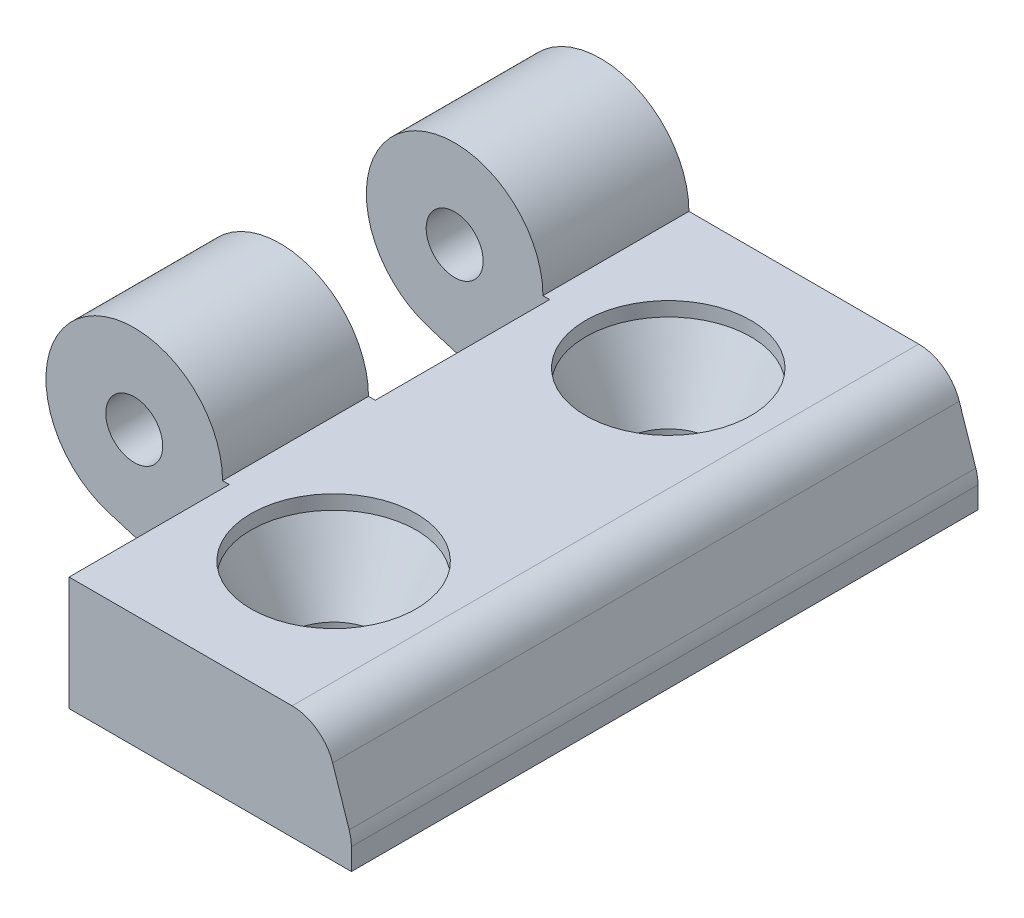
ISO-10303-21;
HEADER;
FILE_DESCRIPTION(('STEP AP214'),'2;1');
FILE_NAME('part.step','',(''),(''),'','','');
FILE_SCHEMA(('AUTOMOTIVE_DESIGN { 1 0 10303 214 1 1 1 1 }'));
ENDSEC;
DATA;
#1=APPLICATION_CONTEXT('core data for automotive mechanical design processes');
#2=APPLICATION_PROTOCOL_DEFINITION('international standard','automotive_design',2000,#1);
#3=PRODUCT_CONTEXT('',#1,'mechanical');
#4=PRODUCT('Part','Part','',(#3));
#5=PRODUCT_RELATED_PRODUCT_CATEGORY('part','',(#4));
#6=PRODUCT_DEFINITION_FORMATION('','',#4);
#7=PRODUCT_DEFINITION_CONTEXT('part definition',#1,'design');
#8=PRODUCT_DEFINITION('design','',#6,#7);
#9=PRODUCT_DEFINITION_SHAPE('','',#8);
#10=(LENGTH_UNIT() NAMED_UNIT(*) SI_UNIT(.MILLI.,.METRE.));
#11=(NAMED_UNIT(*) PLANE_ANGLE_UNIT() SI_UNIT($,.RADIAN.));
#12=(NAMED_UNIT(*) SI_UNIT($,.STERADIAN.) SOLID_ANGLE_UNIT());
#13=UNCERTAINTY_MEASURE_WITH_UNIT(LENGTH_MEASURE(1.E-05),#10,'distance_accuracy_value','');
#14=(GEOMETRIC_REPRESENTATION_CONTEXT(3) GLOBAL_UNCERTAINTY_ASSIGNED_CONTEXT((#13)) GLOBAL_UNIT_ASSIGNED_CONTEXT((#10,
#11,#12)) REPRESENTATION_CONTEXT('',''));
#15=CARTESIAN_POINT('',(0.,0.,0.));
#16=DIRECTION('',(0.,0.,1.));
#17=DIRECTION('',(1.,0.,0.));
#18=AXIS2_PLACEMENT_3D('',#15,#16,#17);
#19=CARTESIAN_POINT('',(5.00000000000045,-8.,22.));
#20=DIRECTION('',(0.,1.,0.));
#21=DIRECTION('',(0.,0.,1.));
#22=AXIS2_PLACEMENT_3D('',#19,#20,#21);
#23=PLANE('',#22);
#24=CARTESIAN_POINT('',(15.,-8.,-11.75));
#25=DIRECTION('',(0.,1.,0.));
#26=DIRECTION('',(-1.,0.,0.));
#27=AXIS2_PLACEMENT_3D('',#24,#25,#26);
#28=CIRCLE('',#27,3.25);
#29=CARTESIAN_POINT('',(11.75,-8.,-11.75));
#30=VERTEX_POINT('',#29);
#31=EDGE_CURVE('E331',#30,#30,#28,.T.);
#32=ORIENTED_EDGE('',*,*,#31,.T.);
#33=EDGE_LOOP('',(#32));
#34=FACE_BOUND('',#33,.T.);
#35=DIRECTION('',(0.,0.,-1.));
#36=VECTOR('',#35,1.);
#37=CARTESIAN_POINT('',(5.00000000000045,-8.,22.));
#38=LINE('',#37,#36);
#39=CARTESIAN_POINT('',(5.00000000000146,-8.00000000000031,10.75));
#40=VERTEX_POINT('',#39);
#41=CARTESIAN_POINT('',(5.00000000000146,-8.00000000000031,0.5));
#42=VERTEX_POINT('',#41);
#43=EDGE_CURVE('E231',#40,#42,#38,.T.);
#44=ORIENTED_EDGE('',*,*,#43,.T.);
#45=DIRECTION('',(1.,0.,0.));
#46=VECTOR('',#45,1.);
#47=CARTESIAN_POINT('',(6.67443888756299,-8.00000000000028,0.5));
#48=LINE('',#47,#46);
#49=CARTESIAN_POINT('',(6.67443888756299,-8.00000000000028,0.5));
#50=VERTEX_POINT('',#49);
#51=EDGE_CURVE('E151',#42,#50,#48,.T.);
#52=ORIENTED_EDGE('',*,*,#51,.T.);
#53=DIRECTION('',(0.,0.,-1.));
#54=VECTOR('',#53,1.);
#55=CARTESIAN_POINT('',(6.67443888756299,-8.00000000000028,0.5));
#56=LINE('',#55,#54);
#57=CARTESIAN_POINT('',(6.67443888756299,-8.00000000000028,-11.75));
#58=VERTEX_POINT('',#57);
#59=EDGE_CURVE('E147',#50,#58,#56,.T.);
#60=ORIENTED_EDGE('',*,*,#59,.T.);
#61=DIRECTION('',(-1.,0.,0.));
#62=VECTOR('',#61,1.);
#63=CARTESIAN_POINT('',(6.67443888756299,-8.00000000000028,-11.75));
#64=LINE('',#63,#62);
#65=CARTESIAN_POINT('',(5.00000000000146,-8.00000000000031,-11.75));
#66=VERTEX_POINT('',#65);
#67=EDGE_CURVE('E154',#58,#66,#64,.T.);
#68=ORIENTED_EDGE('',*,*,#67,.T.);
#69=CARTESIAN_POINT('',(5.00000000000045,-8.,-22.));
#70=VERTEX_POINT('',#69);
#71=EDGE_CURVE('E212',#66,#70,#38,.T.);
#72=ORIENTED_EDGE('',*,*,#71,.T.);
#73=DIRECTION('',(1.,0.,0.));
#74=VECTOR('',#73,1.);
#75=CARTESIAN_POINT('',(5.00000000000045,-8.,-22.));
#76=LINE('',#75,#74);
#77=CARTESIAN_POINT('',(26.5,-8.,-22.));
#78=VERTEX_POINT('',#77);
#79=EDGE_CURVE('E197',#70,#78,#76,.T.);
#80=ORIENTED_EDGE('',*,*,#79,.T.);
#81=DIRECTION('',(0.,0.,-1.));
#82=VECTOR('',#81,1.);
#83=CARTESIAN_POINT('',(26.5,-8.,22.));
#84=LINE('',#83,#82);
#85=CARTESIAN_POINT('',(26.5,-8.,22.));
#86=VERTEX_POINT('',#85);
#87=EDGE_CURVE('E253',#86,#78,#84,.T.);
#88=ORIENTED_EDGE('',*,*,#87,.F.);
#89=DIRECTION('',(1.,0.,0.));
#90=VECTOR('',#89,1.);
#91=CARTESIAN_POINT('',(5.00000000000045,-8.,22.));
#92=LINE('',#91,#90);
#93=CARTESIAN_POINT('',(6.67443888756299,-8.,22.));
#94=VERTEX_POINT('',#93);
#95=EDGE_CURVE('E198',#94,#86,#92,.T.);
#96=ORIENTED_EDGE('',*,*,#95,.F.);
#97=DIRECTION('',(0.,0.,-1.));
#98=VECTOR('',#97,1.);
#99=CARTESIAN_POINT('',(6.67443888756299,-8.00000000000028,22.));
#100=LINE('',#99,#98);
#101=CARTESIAN_POINT('',(6.67443888756299,-8.00000000000028,10.75));
#102=VERTEX_POINT('',#101);
#103=EDGE_CURVE('E58',#94,#102,#100,.T.);
#104=ORIENTED_EDGE('',*,*,#103,.T.);
#105=DIRECTION('',(-1.,0.,0.));
#106=VECTOR('',#105,1.);
#107=CARTESIAN_POINT('',(6.67443888756299,-8.00000000000028,10.75));
#108=LINE('',#107,#106);
#109=EDGE_CURVE('E180',#102,#40,#108,.T.);
#110=ORIENTED_EDGE('',*,*,#109,.T.);
#111=EDGE_LOOP('',(#44,#52,#60,#68,#72,#80,#88,#96,#104,#110));
#112=FACE_BOUND('',#111,.T.);
#113=CARTESIAN_POINT('',(15.,-8.,11.75));
#114=DIRECTION('',(0.,1.,0.));
#115=DIRECTION('',(-1.,0.,0.));
#116=AXIS2_PLACEMENT_3D('',#113,#114,#115);
#117=CIRCLE('',#116,3.25);
#118=CARTESIAN_POINT('',(11.75,-8.,11.75));
#119=VERTEX_POINT('',#118);
#120=EDGE_CURVE('E538',#119,#119,#117,.T.);
#121=ORIENTED_EDGE('',*,*,#120,.T.);
#122=EDGE_LOOP('',(#121));
#123=FACE_BOUND('',#122,.T.);
#124=ADVANCED_FACE('F35',(#34,#112,#123),#23,.F.);
#125=CARTESIAN_POINT('',(6.19999999999982,0.,22.));
#126=DIRECTION('',(0.,-1.,0.));
#127=DIRECTION('',(1.,0.,0.));
#128=AXIS2_PLACEMENT_3D('',#125,#126,#127);
#129=PLANE('',#128);
#130=CARTESIAN_POINT('',(15.,2.23866064574807E-13,-11.75));
#131=DIRECTION('',(0.,1.,0.));
#132=DIRECTION('',(-1.,0.,0.));
#133=AXIS2_PLACEMENT_3D('',#130,#131,#132);
#134=CIRCLE('',#133,5.8);
#135=CARTESIAN_POINT('',(9.2,2.26381413614973E-13,-11.75));
#136=VERTEX_POINT('',#135);
#137=EDGE_CURVE('E346',#136,#136,#134,.T.);
#138=ORIENTED_EDGE('',*,*,#137,.F.);
#139=EDGE_LOOP('',(#138));
#140=FACE_BOUND('',#139,.T.);
#141=DIRECTION('',(0.,0.,1.));
#142=VECTOR('',#141,1.);
#143=CARTESIAN_POINT('',(6.67443888756287,0.,22.));
#144=LINE('',#143,#142);
#145=CARTESIAN_POINT('',(6.67443888756287,0.,-11.75));
#146=VERTEX_POINT('',#145);
#147=CARTESIAN_POINT('',(6.67443888756287,0.,0.5));
#148=VERTEX_POINT('',#147);
#149=EDGE_CURVE('E11',#146,#148,#144,.T.);
#150=ORIENTED_EDGE('',*,*,#149,.T.);
#151=DIRECTION('',(-1.,0.,0.));
#152=VECTOR('',#151,1.);
#153=CARTESIAN_POINT('',(6.19999999999982,0.,0.5));
#154=LINE('',#153,#152);
#155=CARTESIAN_POINT('',(6.19999999999991,0.,0.5));
#156=VERTEX_POINT('',#155);
#157=EDGE_CURVE('E176',#148,#156,#154,.T.);
#158=ORIENTED_EDGE('',*,*,#157,.T.);
#159=DIRECTION('',(0.,0.,-1.));
#160=VECTOR('',#159,1.);
#161=CARTESIAN_POINT('',(6.19999999999982,0.,22.));
#162=LINE('',#161,#160);
#163=CARTESIAN_POINT('',(6.19999999999991,0.,10.75));
#164=VERTEX_POINT('',#163);
#165=EDGE_CURVE('E238',#164,#156,#162,.T.);
#166=ORIENTED_EDGE('',*,*,#165,.F.);
#167=DIRECTION('',(1.,0.,0.));
#168=VECTOR('',#167,1.);
#169=CARTESIAN_POINT('',(6.19999999999982,0.,10.75));
#170=LINE('',#169,#168);
#171=CARTESIAN_POINT('',(6.67443888756288,0.,10.75));
#172=VERTEX_POINT('',#171);
#173=EDGE_CURVE('E194',#164,#172,#170,.T.);
#174=ORIENTED_EDGE('',*,*,#173,.T.);
#175=DIRECTION('',(0.,0.,1.));
#176=VECTOR('',#175,1.);
#177=CARTESIAN_POINT('',(6.67443888756288,0.,22.));
#178=LINE('',#177,#176);
#179=CARTESIAN_POINT('',(6.67443888756288,1.14491749414469E-13,22.));
#180=VERTEX_POINT('',#179);
#181=EDGE_CURVE('E186',#172,#180,#178,.T.);
#182=ORIENTED_EDGE('',*,*,#181,.T.);
#183=DIRECTION('',(-1.,0.,0.));
#184=VECTOR('',#183,1.);
#185=CARTESIAN_POINT('',(6.19999999999982,0.,22.));
#186=LINE('',#185,#184);
#187=CARTESIAN_POINT('',(22.3377223398315,2.26381413614973E-13,22.));
#188=VERTEX_POINT('',#187);
#189=EDGE_CURVE('E209',#188,#180,#186,.T.);
#190=ORIENTED_EDGE('',*,*,#189,.F.);
#191=DIRECTION('',(0.,0.,-1.));
#192=VECTOR('',#191,1.);
#193=CARTESIAN_POINT('',(22.3377223398315,2.26381413614973E-13,22.));
#194=LINE('',#193,#192);
#195=CARTESIAN_POINT('',(22.3377223398315,2.26381413614973E-13,-22.));
#196=VERTEX_POINT('',#195);
#197=EDGE_CURVE('E241',#188,#196,#194,.T.);
#198=ORIENTED_EDGE('',*,*,#197,.T.);
#199=DIRECTION('',(-1.,0.,0.));
#200=VECTOR('',#199,1.);
#201=CARTESIAN_POINT('',(6.19999999999982,0.,-22.));
#202=LINE('',#201,#200);
#203=CARTESIAN_POINT('',(6.19999999999982,0.,-22.));
#204=VERTEX_POINT('',#203);
#205=EDGE_CURVE('E223',#196,#204,#202,.T.);
#206=ORIENTED_EDGE('',*,*,#205,.T.);
#207=CARTESIAN_POINT('',(6.19999999999991,0.,-11.75));
#208=VERTEX_POINT('',#207);
#209=EDGE_CURVE('E237',#208,#204,#162,.T.);
#210=ORIENTED_EDGE('',*,*,#209,.F.);
#211=DIRECTION('',(1.,0.,0.));
#212=VECTOR('',#211,1.);
#213=CARTESIAN_POINT('',(6.19999999999982,0.,-11.75));
#214=LINE('',#213,#212);
#215=EDGE_CURVE('E172',#208,#146,#214,.T.);
#216=ORIENTED_EDGE('',*,*,#215,.T.);
#217=EDGE_LOOP('',(#150,#158,#166,#174,#182,#190,#198,#206,#210,#216));
#218=FACE_BOUND('',#217,.T.);
#219=CARTESIAN_POINT('',(15.,2.23866064574807E-13,11.75));
#220=DIRECTION('',(0.,1.,0.));
#221=DIRECTION('',(-1.,0.,0.));
#222=AXIS2_PLACEMENT_3D('',#219,#220,#221);
#223=CIRCLE('',#222,5.8);
#224=CARTESIAN_POINT('',(9.2,2.26381413614973E-13,11.75));
#225=VERTEX_POINT('',#224);
#226=EDGE_CURVE('E334',#225,#225,#223,.T.);
#227=ORIENTED_EDGE('',*,*,#226,.F.);
#228=EDGE_LOOP('',(#227));
#229=FACE_BOUND('',#228,.T.);
#230=ADVANCED_FACE('F276',(#140,#218,#229),#129,.F.);
#231=CARTESIAN_POINT('',(0.,0.,22.));
#232=DIRECTION('',(0.,0.,-1.));
#233=DIRECTION('',(-1.,0.,0.));
#234=AXIS2_PLACEMENT_3D('',#231,#232,#233);
#235=CYLINDRICAL_SURFACE('',#234,6.19999999999991);
#236=DIRECTION('',(0.,0.,-1.));
#237=VECTOR('',#236,1.);
#238=CARTESIAN_POINT('',(-1.80318600538229,-5.93199125336445,22.));
#239=LINE('',#238,#237);
#240=CARTESIAN_POINT('',(-1.80318600538229,-5.93199125336445,-11.75));
#241=VERTEX_POINT('',#240);
#242=CARTESIAN_POINT('',(-1.80318600538229,-5.93199125336445,-22.));
#243=VERTEX_POINT('',#242);
#244=EDGE_CURVE('E233',#241,#243,#239,.T.);
#245=ORIENTED_EDGE('',*,*,#244,.F.);
#246=CARTESIAN_POINT('',(0.,0.,-11.75));
#247=DIRECTION('',(0.,0.,-1.));
#248=DIRECTION('',(-1.,0.,0.));
#249=AXIS2_PLACEMENT_3D('',#246,#247,#248);
#250=CIRCLE('',#249,6.19999999999991);
#251=EDGE_CURVE('E50',#241,#208,#250,.T.);
#252=ORIENTED_EDGE('',*,*,#251,.T.);
#253=ORIENTED_EDGE('',*,*,#209,.T.);
#254=CARTESIAN_POINT('',(0.,0.,-22.));
#255=DIRECTION('',(0.,0.,1.));
#256=DIRECTION('',(1.,0.,0.));
#257=AXIS2_PLACEMENT_3D('',#254,#255,#256);
#258=CIRCLE('',#257,6.19999999999991);
#259=EDGE_CURVE('E226',#204,#243,#258,.T.);
#260=ORIENTED_EDGE('',*,*,#259,.T.);
#261=EDGE_LOOP('',(#245,#252,#253,#260));
#262=FACE_BOUND('',#261,.T.);
#263=ADVANCED_FACE('F281',(#262),#235,.T.);
#264=CARTESIAN_POINT('',(5.00000000000045,-8.,22.));
#265=DIRECTION('',(0.290836452481103,0.956772782800706,0.));
#266=DIRECTION('',(-0.956772782800706,0.290836452481103,0.));
#267=AXIS2_PLACEMENT_3D('',#264,#265,#266);
#268=PLANE('',#267);
#269=CARTESIAN_POINT('',(-1.80318600538229,-5.93199125336455,10.75));
#270=VERTEX_POINT('',#269);
#271=CARTESIAN_POINT('',(-1.80318600538229,-5.93199125336455,0.500000000000001));
#272=VERTEX_POINT('',#271);
#273=EDGE_CURVE('E234',#270,#272,#239,.T.);
#274=ORIENTED_EDGE('',*,*,#273,.T.);
#275=DIRECTION('',(0.956772782800706,-0.290836452481103,0.));
#276=VECTOR('',#275,1.);
#277=CARTESIAN_POINT('',(5.00000000000045,-8.,0.5));
#278=LINE('',#277,#276);
#279=EDGE_CURVE('E43',#272,#42,#278,.T.);
#280=ORIENTED_EDGE('',*,*,#279,.T.);
#281=ORIENTED_EDGE('',*,*,#43,.F.);
#282=DIRECTION('',(-0.956772782800706,0.290836452481103,0.));
#283=VECTOR('',#282,1.);
#284=CARTESIAN_POINT('',(5.00000000000045,-8.,10.75));
#285=LINE('',#284,#283);
#286=EDGE_CURVE('E256',#40,#270,#285,.T.);
#287=ORIENTED_EDGE('',*,*,#286,.T.);
#288=EDGE_LOOP('',(#274,#280,#281,#287));
#289=FACE_BOUND('',#288,.T.);
#290=ADVANCED_FACE('F264',(#289),#268,.F.);
#291=CARTESIAN_POINT('',(26.5,-8.,22.));
#292=DIRECTION('',(-1.,0.,0.));
#293=DIRECTION('',(0.,0.,1.));
#294=AXIS2_PLACEMENT_3D('',#291,#292,#293);
#295=PLANE('',#294);
#296=DIRECTION('',(0.,1.,0.));
#297=VECTOR('',#296,1.);
#298=CARTESIAN_POINT('',(26.5,-8.,-22.));
#299=LINE('',#298,#297);
#300=CARTESIAN_POINT('',(26.5,-6.48683298050492,-22.));
#301=VERTEX_POINT('',#300);
#302=EDGE_CURVE('E215',#78,#301,#299,.T.);
#303=ORIENTED_EDGE('',*,*,#302,.T.);
#304=DIRECTION('',(0.,0.,-1.));
#305=VECTOR('',#304,1.);
#306=CARTESIAN_POINT('',(26.5,-6.48683298050492,22.));
#307=LINE('',#306,#305);
#308=CARTESIAN_POINT('',(26.5,-6.48683298050492,22.));
#309=VERTEX_POINT('',#308);
#310=EDGE_CURVE('E250',#309,#301,#307,.T.);
#311=ORIENTED_EDGE('',*,*,#310,.F.);
#312=DIRECTION('',(0.,1.,0.));
#313=VECTOR('',#312,1.);
#314=CARTESIAN_POINT('',(26.5,-8.,22.));
#315=LINE('',#314,#313);
#316=EDGE_CURVE('E200',#86,#309,#315,.T.);
#317=ORIENTED_EDGE('',*,*,#316,.F.);
#318=ORIENTED_EDGE('',*,*,#87,.T.);
#319=EDGE_LOOP('',(#303,#311,#317,#318));
#320=FACE_BOUND('',#319,.T.);
#321=ADVANCED_FACE('F295',(#320),#295,.F.);
#322=CARTESIAN_POINT('',(23.5,-6.48683298050492,22.));
#323=DIRECTION('',(0.,0.,-1.));
#324=DIRECTION('',(-1.,0.,0.));
#325=AXIS2_PLACEMENT_3D('',#322,#323,#324);
#326=CYLINDRICAL_SURFACE('',#325,3.00000000000007);
#327=CARTESIAN_POINT('',(23.5,-6.48683298050492,-22.));
#328=DIRECTION('',(0.,0.,1.));
#329=DIRECTION('',(1.,0.,0.));
#330=AXIS2_PLACEMENT_3D('',#327,#328,#329);
#331=CIRCLE('',#330,3.00000000000007);
#332=CARTESIAN_POINT('',(26.3460498941517,-5.53814968245458,-22.));
#333=VERTEX_POINT('',#332);
#334=EDGE_CURVE('E217',#301,#333,#331,.T.);
#335=ORIENTED_EDGE('',*,*,#334,.T.);
#336=DIRECTION('',(0.,0.,-1.));
#337=VECTOR('',#336,1.);
#338=CARTESIAN_POINT('',(26.3460498941517,-5.53814968245458,22.));
#339=LINE('',#338,#337);
#340=CARTESIAN_POINT('',(26.3460498941517,-5.53814968245458,22.));
#341=VERTEX_POINT('',#340);
#342=EDGE_CURVE('E247',#341,#333,#339,.T.);
#343=ORIENTED_EDGE('',*,*,#342,.F.);
#344=CARTESIAN_POINT('',(23.5,-6.48683298050492,22.));
#345=DIRECTION('',(0.,0.,1.));
#346=DIRECTION('',(1.,0.,0.));
#347=AXIS2_PLACEMENT_3D('',#344,#345,#346);
#348=CIRCLE('',#347,3.00000000000007);
#349=EDGE_CURVE('E203',#309,#341,#348,.T.);
#350=ORIENTED_EDGE('',*,*,#349,.F.);
#351=ORIENTED_EDGE('',*,*,#310,.T.);
#352=EDGE_LOOP('',(#335,#343,#350,#351));
#353=FACE_BOUND('',#352,.T.);
#354=ADVANCED_FACE('F313',(#353),#326,.T.);
#355=CARTESIAN_POINT('',(26.3460498941518,-5.53814968245456,22.));
#356=DIRECTION('',(-0.948683298050495,-0.316227766016894,0.));
#357=DIRECTION('',(0.316227766016894,-0.948683298050495,0.));
#358=AXIS2_PLACEMENT_3D('',#355,#356,#357);
#359=PLANE('',#358);
#360=DIRECTION('',(-0.316227766016894,0.948683298050495,0.));
#361=VECTOR('',#360,1.);
#362=CARTESIAN_POINT('',(26.3460498941518,-5.53814968245456,-22.));
#363=LINE('',#362,#361);
#364=CARTESIAN_POINT('',(25.183772233983,-2.05131670194905,-22.));
#365=VERTEX_POINT('',#364);
#366=EDGE_CURVE('E219',#333,#365,#363,.T.);
#367=ORIENTED_EDGE('',*,*,#366,.T.);
#368=DIRECTION('',(0.,0.,-1.));
#369=VECTOR('',#368,1.);
#370=CARTESIAN_POINT('',(25.183772233983,-2.05131670194905,22.));
#371=LINE('',#370,#369);
#372=CARTESIAN_POINT('',(25.183772233983,-2.05131670194905,22.));
#373=VERTEX_POINT('',#372);
#374=EDGE_CURVE('E244',#373,#365,#371,.T.);
#375=ORIENTED_EDGE('',*,*,#374,.F.);
#376=DIRECTION('',(-0.316227766016894,0.948683298050495,0.));
#377=VECTOR('',#376,1.);
#378=CARTESIAN_POINT('',(26.3460498941518,-5.53814968245456,22.));
#379=LINE('',#378,#377);
#380=EDGE_CURVE('E205',#341,#373,#379,.T.);
#381=ORIENTED_EDGE('',*,*,#380,.F.);
#382=ORIENTED_EDGE('',*,*,#342,.T.);
#383=EDGE_LOOP('',(#367,#375,#381,#382));
#384=FACE_BOUND('',#383,.T.);
#385=ADVANCED_FACE('F311',(#384),#359,.F.);
#386=CARTESIAN_POINT('',(22.3377223398315,-2.99999999999977,22.));
#387=DIRECTION('',(0.,0.,-1.));
#388=DIRECTION('',(-1.,0.,0.));
#389=AXIS2_PLACEMENT_3D('',#386,#387,#388);
#390=CYLINDRICAL_SURFACE('',#389,3.);
#391=CARTESIAN_POINT('',(22.3377223398315,-2.99999999999977,-22.));
#392=DIRECTION('',(0.,0.,1.));
#393=DIRECTION('',(1.,0.,0.));
#394=AXIS2_PLACEMENT_3D('',#391,#392,#393);
#395=CIRCLE('',#394,3.);
#396=EDGE_CURVE('E221',#365,#196,#395,.T.);
#397=ORIENTED_EDGE('',*,*,#396,.T.);
#398=ORIENTED_EDGE('',*,*,#197,.F.);
#399=CARTESIAN_POINT('',(22.3377223398315,-2.99999999999977,22.));
#400=DIRECTION('',(0.,0.,1.));
#401=DIRECTION('',(1.,0.,0.));
#402=AXIS2_PLACEMENT_3D('',#399,#400,#401);
#403=CIRCLE('',#402,3.);
#404=EDGE_CURVE('E207',#373,#188,#403,.T.);
#405=ORIENTED_EDGE('',*,*,#404,.F.);
#406=ORIENTED_EDGE('',*,*,#374,.T.);
#407=EDGE_LOOP('',(#397,#398,#405,#406));
#408=FACE_BOUND('',#407,.T.);
#409=ADVANCED_FACE('F307',(#408),#390,.T.);
#410=CARTESIAN_POINT('',(0.,0.,0.5));
#411=DIRECTION('',(0.,0.,1.));
#412=DIRECTION('',(1.,0.,0.));
#413=AXIS2_PLACEMENT_3D('',#410,#411,#412);
#414=CIRCLE('',#413,6.19999999999991);
#415=EDGE_CURVE('E174',#156,#272,#414,.T.);
#416=ORIENTED_EDGE('',*,*,#415,.T.);
#417=ORIENTED_EDGE('',*,*,#273,.F.);
#418=CARTESIAN_POINT('',(0.,0.,10.75));
#419=DIRECTION('',(0.,0.,-1.));
#420=DIRECTION('',(-1.,0.,0.));
#421=AXIS2_PLACEMENT_3D('',#418,#419,#420);
#422=CIRCLE('',#421,6.19999999999991);
#423=EDGE_CURVE('E191',#270,#164,#422,.T.);
#424=ORIENTED_EDGE('',*,*,#423,.T.);
#425=ORIENTED_EDGE('',*,*,#165,.T.);
#426=EDGE_LOOP('',(#416,#417,#424,#425));
#427=FACE_BOUND('',#426,.T.);
#428=ADVANCED_FACE('F272',(#427),#235,.T.);
#429=ORIENTED_EDGE('',*,*,#71,.F.);
#430=DIRECTION('',(-0.956772782800706,0.290836452481103,0.));
#431=VECTOR('',#430,1.);
#432=CARTESIAN_POINT('',(5.00000000000045,-8.,-11.75));
#433=LINE('',#432,#431);
#434=EDGE_CURVE('E156',#66,#241,#433,.T.);
#435=ORIENTED_EDGE('',*,*,#434,.T.);
#436=ORIENTED_EDGE('',*,*,#244,.T.);
#437=DIRECTION('',(0.956772782800706,-0.290836452481103,0.));
#438=VECTOR('',#437,1.);
#439=CARTESIAN_POINT('',(5.00000000000045,-8.,-22.));
#440=LINE('',#439,#438);
#441=EDGE_CURVE('E201',#243,#70,#440,.T.);
#442=ORIENTED_EDGE('',*,*,#441,.T.);
#443=EDGE_LOOP('',(#429,#435,#436,#442));
#444=FACE_BOUND('',#443,.T.);
#445=ADVANCED_FACE('F285',(#444),#268,.F.);
#446=CARTESIAN_POINT('',(23.5,-6.48683298050492,22.));
#447=DIRECTION('',(0.,0.,1.));
#448=DIRECTION('',(1.,0.,0.));
#449=AXIS2_PLACEMENT_3D('',#446,#447,#448);
#450=PLANE('',#449);
#451=DIRECTION('',(0.,1.,0.));
#452=VECTOR('',#451,1.);
#453=CARTESIAN_POINT('',(6.67443888756299,-8.00000000000028,22.));
#454=LINE('',#453,#452);
#455=EDGE_CURVE('E184',#94,#180,#454,.T.);
#456=ORIENTED_EDGE('',*,*,#455,.F.);
#457=ORIENTED_EDGE('',*,*,#95,.T.);
#458=ORIENTED_EDGE('',*,*,#316,.T.);
#459=ORIENTED_EDGE('',*,*,#349,.T.);
#460=ORIENTED_EDGE('',*,*,#380,.T.);
#461=ORIENTED_EDGE('',*,*,#404,.T.);
#462=ORIENTED_EDGE('',*,*,#189,.T.);
#463=EDGE_LOOP('',(#456,#457,#458,#459,#460,#461,#462));
#464=FACE_BOUND('',#463,.T.);
#465=ADVANCED_FACE('F298',(#464),#450,.T.);
#466=CARTESIAN_POINT('',(23.5,-6.48683298050492,-22.));
#467=DIRECTION('',(0.,0.,1.));
#468=DIRECTION('',(1.,0.,0.));
#469=AXIS2_PLACEMENT_3D('',#466,#467,#468);
#470=PLANE('',#469);
#471=CARTESIAN_POINT('',(0.,0.,-22.));
#472=DIRECTION('',(0.,0.,-1.));
#473=DIRECTION('',(-1.,0.,0.));
#474=AXIS2_PLACEMENT_3D('',#471,#472,#473);
#475=CIRCLE('',#474,2.);
#476=CARTESIAN_POINT('',(-2.,0.,-22.));
#477=VERTEX_POINT('',#476);
#478=EDGE_CURVE('E349',#477,#477,#475,.T.);
#479=ORIENTED_EDGE('',*,*,#478,.F.);
#480=EDGE_LOOP('',(#479));
#481=FACE_BOUND('',#480,.T.);
#482=ORIENTED_EDGE('',*,*,#79,.F.);
#483=ORIENTED_EDGE('',*,*,#441,.F.);
#484=ORIENTED_EDGE('',*,*,#259,.F.);
#485=ORIENTED_EDGE('',*,*,#205,.F.);
#486=ORIENTED_EDGE('',*,*,#396,.F.);
#487=ORIENTED_EDGE('',*,*,#366,.F.);
#488=ORIENTED_EDGE('',*,*,#334,.F.);
#489=ORIENTED_EDGE('',*,*,#302,.F.);
#490=EDGE_LOOP('',(#482,#483,#484,#485,#486,#487,#488,#489));
#491=FACE_BOUND('',#490,.T.);
#492=ADVANCED_FACE('F289',(#481,#491),#470,.F.);
#493=CARTESIAN_POINT('',(6.67443888756299,-8.00000000000028,10.75));
#494=DIRECTION('',(0.,0.,-1.));
#495=DIRECTION('',(-1.,0.,0.));
#496=AXIS2_PLACEMENT_3D('',#493,#494,#495);
#497=PLANE('',#496);
#498=CARTESIAN_POINT('',(0.,0.,10.75));
#499=DIRECTION('',(0.,0.,-1.));
#500=DIRECTION('',(-1.,0.,0.));
#501=AXIS2_PLACEMENT_3D('',#498,#499,#500);
#502=CIRCLE('',#501,2.);
#503=CARTESIAN_POINT('',(-2.,0.,10.75));
#504=VERTEX_POINT('',#503);
#505=EDGE_CURVE('E162',#504,#504,#502,.T.);
#506=ORIENTED_EDGE('',*,*,#505,.T.);
#507=EDGE_LOOP('',(#506));
#508=FACE_BOUND('',#507,.T.);
#509=ORIENTED_EDGE('',*,*,#423,.F.);
#510=ORIENTED_EDGE('',*,*,#286,.F.);
#511=ORIENTED_EDGE('',*,*,#109,.F.);
#512=DIRECTION('',(0.,1.,0.));
#513=VECTOR('',#512,1.);
#514=CARTESIAN_POINT('',(6.67443888756299,-8.00000000000028,10.75));
#515=LINE('',#514,#513);
#516=EDGE_CURVE('E183',#102,#172,#515,.T.);
#517=ORIENTED_EDGE('',*,*,#516,.T.);
#518=ORIENTED_EDGE('',*,*,#173,.F.);
#519=EDGE_LOOP('',(#509,#510,#511,#517,#518));
#520=FACE_BOUND('',#519,.T.);
#521=ADVANCED_FACE('F270',(#508,#520),#497,.F.);
#522=CARTESIAN_POINT('',(6.67443888756299,-8.00000000000028,22.));
#523=DIRECTION('',(1.,0.,0.));
#524=DIRECTION('',(0.,1.,0.));
#525=AXIS2_PLACEMENT_3D('',#522,#523,#524);
#526=PLANE('',#525);
#527=ORIENTED_EDGE('',*,*,#516,.F.);
#528=ORIENTED_EDGE('',*,*,#103,.F.);
#529=ORIENTED_EDGE('',*,*,#455,.T.);
#530=ORIENTED_EDGE('',*,*,#181,.F.);
#531=EDGE_LOOP('',(#527,#528,#529,#530));
#532=FACE_BOUND('',#531,.T.);
#533=ADVANCED_FACE('F301',(#532),#526,.F.);
#534=CARTESIAN_POINT('',(6.67443888756299,-8.00000000000028,0.5));
#535=DIRECTION('',(1.,0.,0.));
#536=DIRECTION('',(0.,1.,0.));
#537=AXIS2_PLACEMENT_3D('',#534,#535,#536);
#538=PLANE('',#537);
#539=DIRECTION('',(0.,1.,0.));
#540=VECTOR('',#539,1.);
#541=CARTESIAN_POINT('',(6.67443888756299,-8.00000000000028,-11.75));
#542=LINE('',#541,#540);
#543=EDGE_CURVE('E142',#58,#146,#542,.T.);
#544=ORIENTED_EDGE('',*,*,#543,.F.);
#545=ORIENTED_EDGE('',*,*,#59,.F.);
#546=DIRECTION('',(0.,1.,0.));
#547=VECTOR('',#546,1.);
#548=CARTESIAN_POINT('',(6.67443888756299,-8.00000000000028,0.5));
#549=LINE('',#548,#547);
#550=EDGE_CURVE('E150',#50,#148,#549,.T.);
#551=ORIENTED_EDGE('',*,*,#550,.T.);
#552=ORIENTED_EDGE('',*,*,#149,.F.);
#553=EDGE_LOOP('',(#544,#545,#551,#552));
#554=FACE_BOUND('',#553,.T.);
#555=ADVANCED_FACE('F144',(#554),#538,.F.);
#556=CARTESIAN_POINT('',(6.67443888756299,-8.00000000000028,0.5));
#557=DIRECTION('',(0.,0.,1.));
#558=DIRECTION('',(1.,0.,0.));
#559=AXIS2_PLACEMENT_3D('',#556,#557,#558);
#560=PLANE('',#559);
#561=CARTESIAN_POINT('',(0.,0.,0.5));
#562=DIRECTION('',(0.,0.,1.));
#563=DIRECTION('',(1.,0.,0.));
#564=AXIS2_PLACEMENT_3D('',#561,#562,#563);
#565=CIRCLE('',#564,2.);
#566=CARTESIAN_POINT('',(2.,0.,0.5));
#567=VERTEX_POINT('',#566);
#568=EDGE_CURVE('E165',#567,#567,#565,.T.);
#569=ORIENTED_EDGE('',*,*,#568,.T.);
#570=EDGE_LOOP('',(#569));
#571=FACE_BOUND('',#570,.T.);
#572=ORIENTED_EDGE('',*,*,#550,.F.);
#573=ORIENTED_EDGE('',*,*,#51,.F.);
#574=ORIENTED_EDGE('',*,*,#279,.F.);
#575=ORIENTED_EDGE('',*,*,#415,.F.);
#576=ORIENTED_EDGE('',*,*,#157,.F.);
#577=EDGE_LOOP('',(#572,#573,#574,#575,#576));
#578=FACE_BOUND('',#577,.T.);
#579=ADVANCED_FACE('F274',(#571,#578),#560,.F.);
#580=CARTESIAN_POINT('',(6.67443888756299,-8.00000000000028,-11.75));
#581=DIRECTION('',(0.,0.,-1.));
#582=DIRECTION('',(-1.,0.,0.));
#583=AXIS2_PLACEMENT_3D('',#580,#581,#582);
#584=PLANE('',#583);
#585=CARTESIAN_POINT('',(0.,0.,-11.75));
#586=DIRECTION('',(0.,0.,-1.));
#587=DIRECTION('',(-1.,0.,0.));
#588=AXIS2_PLACEMENT_3D('',#585,#586,#587);
#589=CIRCLE('',#588,2.);
#590=CARTESIAN_POINT('',(-2.,0.,-11.75));
#591=VERTEX_POINT('',#590);
#592=EDGE_CURVE('E38',#591,#591,#589,.T.);
#593=ORIENTED_EDGE('',*,*,#592,.T.);
#594=EDGE_LOOP('',(#593));
#595=FACE_BOUND('',#594,.T.);
#596=ORIENTED_EDGE('',*,*,#251,.F.);
#597=ORIENTED_EDGE('',*,*,#434,.F.);
#598=ORIENTED_EDGE('',*,*,#67,.F.);
#599=ORIENTED_EDGE('',*,*,#543,.T.);
#600=ORIENTED_EDGE('',*,*,#215,.F.);
#601=EDGE_LOOP('',(#596,#597,#598,#599,#600));
#602=FACE_BOUND('',#601,.T.);
#603=ADVANCED_FACE('F155',(#595,#602),#584,.F.);
#604=CARTESIAN_POINT('',(0.,0.,22.));
#605=DIRECTION('',(0.,0.,-1.));
#606=DIRECTION('',(-1.,0.,0.));
#607=AXIS2_PLACEMENT_3D('',#604,#605,#606);
#608=CYLINDRICAL_SURFACE('',#607,2.);
#609=ORIENTED_EDGE('',*,*,#478,.T.);
#610=EDGE_LOOP('',(#609));
#611=FACE_BOUND('',#610,.T.);
#612=ORIENTED_EDGE('',*,*,#592,.F.);
#613=EDGE_LOOP('',(#612));
#614=FACE_BOUND('',#613,.T.);
#615=ADVANCED_FACE('F358',(#611,#614),#608,.F.);
#616=ORIENTED_EDGE('',*,*,#568,.F.);
#617=EDGE_LOOP('',(#616));
#618=FACE_BOUND('',#617,.T.);
#619=ORIENTED_EDGE('',*,*,#505,.F.);
#620=EDGE_LOOP('',(#619));
#621=FACE_BOUND('',#620,.T.);
#622=ADVANCED_FACE('F360',(#618,#621),#608,.F.);
#623=CARTESIAN_POINT('',(15.,2.26381413614973E-13,-11.75));
#624=DIRECTION('',(0.,1.,0.));
#625=DIRECTION('',(-1.,0.,0.));
#626=AXIS2_PLACEMENT_3D('',#623,#624,#625);
#627=CYLINDRICAL_SURFACE('',#626,5.8);
#628=ORIENTED_EDGE('',*,*,#137,.T.);
#629=EDGE_LOOP('',(#628));
#630=FACE_BOUND('',#629,.T.);
#631=CARTESIAN_POINT('',(15.,-0.999999999999776,-11.75));
#632=DIRECTION('',(0.,1.,0.));
#633=DIRECTION('',(-1.,0.,0.));
#634=AXIS2_PLACEMENT_3D('',#631,#632,#633);
#635=CIRCLE('',#634,5.8);
#636=CARTESIAN_POINT('',(9.2,-0.999999999999774,-11.75));
#637=VERTEX_POINT('',#636);
#638=EDGE_CURVE('E337',#637,#637,#635,.T.);
#639=ORIENTED_EDGE('',*,*,#638,.F.);
#640=EDGE_LOOP('',(#639));
#641=FACE_BOUND('',#640,.T.);
#642=ADVANCED_FACE('F367',(#630,#641),#627,.F.);
#643=CARTESIAN_POINT('',(15.,-6.,-11.75));
#644=DIRECTION('',(0.,1.,0.));
#645=DIRECTION('',(-1.,0.,0.));
#646=AXIS2_PLACEMENT_3D('',#643,#644,#645);
#647=CONICAL_SURFACE('',#646,3.25,0.47161556786231);
#648=ORIENTED_EDGE('',*,*,#638,.T.);
#649=EDGE_LOOP('',(#648));
#650=FACE_BOUND('',#649,.T.);
#651=CARTESIAN_POINT('',(15.,-6.,-11.75));
#652=DIRECTION('',(0.,1.,0.));
#653=DIRECTION('',(-1.,0.,0.));
#654=AXIS2_PLACEMENT_3D('',#651,#652,#653);
#655=CIRCLE('',#654,3.25);
#656=CARTESIAN_POINT('',(11.75,-6.,-11.75));
#657=VERTEX_POINT('',#656);
#658=EDGE_CURVE('E333',#657,#657,#655,.T.);
#659=ORIENTED_EDGE('',*,*,#658,.F.);
#660=EDGE_LOOP('',(#659));
#661=FACE_BOUND('',#660,.T.);
#662=ADVANCED_FACE('F472',(#650,#661),#647,.F.);
#663=CARTESIAN_POINT('',(15.,2.26381413614973E-13,-11.75));
#664=DIRECTION('',(0.,1.,0.));
#665=DIRECTION('',(-1.,0.,0.));
#666=AXIS2_PLACEMENT_3D('',#663,#664,#665);
#667=CYLINDRICAL_SURFACE('',#666,3.25);
#668=ORIENTED_EDGE('',*,*,#658,.T.);
#669=EDGE_LOOP('',(#668));
#670=FACE_BOUND('',#669,.T.);
#671=ORIENTED_EDGE('',*,*,#31,.F.);
#672=EDGE_LOOP('',(#671));
#673=FACE_BOUND('',#672,.T.);
#674=ADVANCED_FACE('F480',(#670,#673),#667,.F.);
#675=CARTESIAN_POINT('',(15.,2.26381413614973E-13,11.75));
#676=DIRECTION('',(0.,1.,0.));
#677=DIRECTION('',(-1.,0.,0.));
#678=AXIS2_PLACEMENT_3D('',#675,#676,#677);
#679=CYLINDRICAL_SURFACE('',#678,5.8);
#680=ORIENTED_EDGE('',*,*,#226,.T.);
#681=EDGE_LOOP('',(#680));
#682=FACE_BOUND('',#681,.T.);
#683=CARTESIAN_POINT('',(15.,-0.999999999999776,11.75));
#684=DIRECTION('',(0.,1.,0.));
#685=DIRECTION('',(-1.,0.,0.));
#686=AXIS2_PLACEMENT_3D('',#683,#684,#685);
#687=CIRCLE('',#686,5.8);
#688=CARTESIAN_POINT('',(9.2,-0.999999999999774,11.75));
#689=VERTEX_POINT('',#688);
#690=EDGE_CURVE('E340',#689,#689,#687,.T.);
#691=ORIENTED_EDGE('',*,*,#690,.F.);
#692=EDGE_LOOP('',(#691));
#693=FACE_BOUND('',#692,.T.);
#694=ADVANCED_FACE('F488',(#682,#693),#679,.F.);
#695=CARTESIAN_POINT('',(15.,-6.,11.75));
#696=DIRECTION('',(0.,1.,0.));
#697=DIRECTION('',(-1.,0.,0.));
#698=AXIS2_PLACEMENT_3D('',#695,#696,#697);
#699=CONICAL_SURFACE('',#698,3.25,0.47161556786231);
#700=ORIENTED_EDGE('',*,*,#690,.T.);
#701=EDGE_LOOP('',(#700));
#702=FACE_BOUND('',#701,.T.);
#703=CARTESIAN_POINT('',(15.,-6.,11.75));
#704=DIRECTION('',(0.,1.,0.));
#705=DIRECTION('',(-1.,0.,0.));
#706=AXIS2_PLACEMENT_3D('',#703,#704,#705);
#707=CIRCLE('',#706,3.25);
#708=CARTESIAN_POINT('',(11.75,-6.,11.75));
#709=VERTEX_POINT('',#708);
#710=EDGE_CURVE('E535',#709,#709,#707,.T.);
#711=ORIENTED_EDGE('',*,*,#710,.F.);
#712=EDGE_LOOP('',(#711));
#713=FACE_BOUND('',#712,.T.);
#714=ADVANCED_FACE('F499',(#702,#713),#699,.F.);
#715=CARTESIAN_POINT('',(15.,2.26381413614973E-13,11.75));
#716=DIRECTION('',(0.,1.,0.));
#717=DIRECTION('',(-1.,0.,0.));
#718=AXIS2_PLACEMENT_3D('',#715,#716,#717);
#719=CYLINDRICAL_SURFACE('',#718,3.25);
#720=ORIENTED_EDGE('',*,*,#710,.T.);
#721=EDGE_LOOP('',(#720));
#722=FACE_BOUND('',#721,.T.);
#723=ORIENTED_EDGE('',*,*,#120,.F.);
#724=EDGE_LOOP('',(#723));
#725=FACE_BOUND('',#724,.T.);
#726=ADVANCED_FACE('F507',(#722,#725),#719,.F.);
#727=CLOSED_SHELL('',(#124,#230,#263,#290,#321,#354,#385,#409,#428,#445,#465,#492,#521,#533,
#555,#579,#603,#615,#622,#642,#662,#674,#694,#714,#726));
#728=MANIFOLD_SOLID_BREP('B2',#727);
#729=ADVANCED_BREP_SHAPE_REPRESENTATION('',(#18,#728),#14);
#730=SHAPE_DEFINITION_REPRESENTATION(#9,#729);
ENDSEC;
END-ISO-10303-21;
